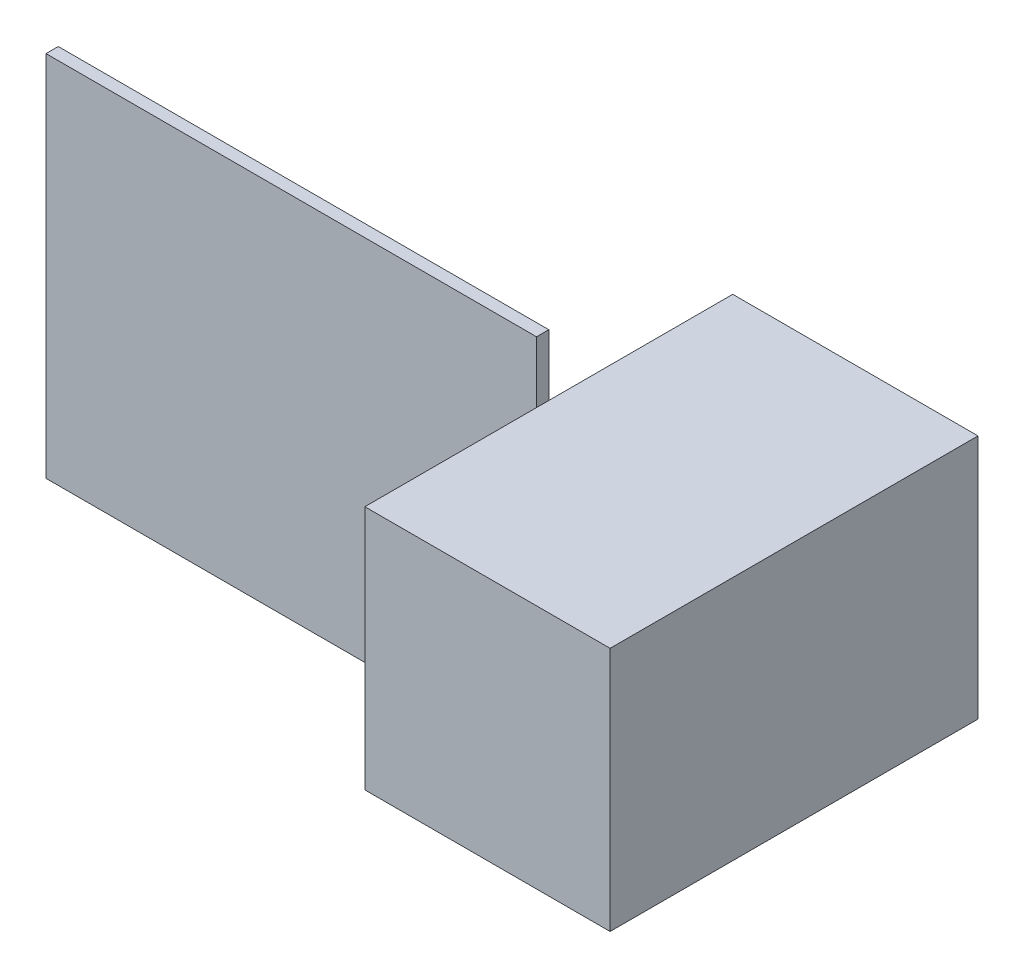
ISO-10303-21;
HEADER;
FILE_DESCRIPTION(('STEP AP214'),'2;1');
FILE_NAME('part.step','',(''),(''),'','','');
FILE_SCHEMA(('AUTOMOTIVE_DESIGN { 1 0 10303 214 1 1 1 1 }'));
ENDSEC;
DATA;
#1=APPLICATION_CONTEXT('core data for automotive mechanical design processes');
#2=APPLICATION_PROTOCOL_DEFINITION('international standard','automotive_design',2000,#1);
#3=PRODUCT_CONTEXT('',#1,'mechanical');
#4=PRODUCT('Part','Part','',(#3));
#5=PRODUCT_RELATED_PRODUCT_CATEGORY('part','',(#4));
#6=PRODUCT_DEFINITION_FORMATION('','',#4);
#7=PRODUCT_DEFINITION_CONTEXT('part definition',#1,'design');
#8=PRODUCT_DEFINITION('design','',#6,#7);
#9=PRODUCT_DEFINITION_SHAPE('','',#8);
#10=(LENGTH_UNIT() NAMED_UNIT(*) SI_UNIT(.MILLI.,.METRE.));
#11=(NAMED_UNIT(*) PLANE_ANGLE_UNIT() SI_UNIT($,.RADIAN.));
#12=(NAMED_UNIT(*) SI_UNIT($,.STERADIAN.) SOLID_ANGLE_UNIT());
#13=UNCERTAINTY_MEASURE_WITH_UNIT(LENGTH_MEASURE(1.E-05),#10,'distance_accuracy_value','');
#14=(GEOMETRIC_REPRESENTATION_CONTEXT(3) GLOBAL_UNCERTAINTY_ASSIGNED_CONTEXT((#13)) GLOBAL_UNIT_ASSIGNED_CONTEXT((#10,
#11,#12)) REPRESENTATION_CONTEXT('',''));
#15=CARTESIAN_POINT('',(0.,0.,0.));
#16=DIRECTION('',(0.,0.,1.));
#17=DIRECTION('',(1.,0.,0.));
#18=AXIS2_PLACEMENT_3D('',#15,#16,#17);
#19=CARTESIAN_POINT('',(40.,30.,2.));
#20=DIRECTION('',(-1.,0.,0.));
#21=DIRECTION('',(0.,0.,1.));
#22=AXIS2_PLACEMENT_3D('',#19,#20,#21);
#23=PLANE('',#22);
#24=DIRECTION('',(0.,0.,1.));
#25=VECTOR('',#24,1.);
#26=CARTESIAN_POINT('',(40.,20.,30.));
#27=LINE('',#26,#25);
#28=CARTESIAN_POINT('',(40.,20.,0.));
#29=VERTEX_POINT('',#28);
#30=CARTESIAN_POINT('',(40.,20.,2.));
#31=VERTEX_POINT('',#30);
#32=EDGE_CURVE('E11',#29,#31,#27,.T.);
#33=ORIENTED_EDGE('',*,*,#32,.F.);
#34=DIRECTION('',(0.,1.,0.));
#35=VECTOR('',#34,1.);
#36=CARTESIAN_POINT('',(40.,30.,0.));
#37=LINE('',#36,#35);
#38=CARTESIAN_POINT('',(40.,30.,0.));
#39=VERTEX_POINT('',#38);
#40=EDGE_CURVE('E161',#29,#39,#37,.T.);
#41=ORIENTED_EDGE('',*,*,#40,.T.);
#42=DIRECTION('',(0.,0.,-1.));
#43=VECTOR('',#42,1.);
#44=CARTESIAN_POINT('',(40.,30.,2.));
#45=LINE('',#44,#43);
#46=CARTESIAN_POINT('',(40.,30.,2.));
#47=VERTEX_POINT('',#46);
#48=EDGE_CURVE('E168',#47,#39,#45,.T.);
#49=ORIENTED_EDGE('',*,*,#48,.F.);
#50=DIRECTION('',(0.,1.,0.));
#51=VECTOR('',#50,1.);
#52=CARTESIAN_POINT('',(40.,30.,2.));
#53=LINE('',#52,#51);
#54=EDGE_CURVE('E52',#31,#47,#53,.T.);
#55=ORIENTED_EDGE('',*,*,#54,.F.);
#56=EDGE_LOOP('',(#33,#41,#49,#55));
#57=FACE_BOUND('',#56,.T.);
#58=ADVANCED_FACE('F33',(#57),#23,.F.);
#59=DIRECTION('',(0.,0.,-1.));
#60=VECTOR('',#59,1.);
#61=CARTESIAN_POINT('',(40.,-20.,30.));
#62=LINE('',#61,#60);
#63=CARTESIAN_POINT('',(40.,-20.,2.));
#64=VERTEX_POINT('',#63);
#65=CARTESIAN_POINT('',(40.,-20.,0.));
#66=VERTEX_POINT('',#65);
#67=EDGE_CURVE('E42',#64,#66,#62,.T.);
#68=ORIENTED_EDGE('',*,*,#67,.F.);
#69=CARTESIAN_POINT('',(40.,-30.,2.));
#70=VERTEX_POINT('',#69);
#71=EDGE_CURVE('E154',#70,#64,#53,.T.);
#72=ORIENTED_EDGE('',*,*,#71,.F.);
#73=DIRECTION('',(0.,0.,-1.));
#74=VECTOR('',#73,1.);
#75=CARTESIAN_POINT('',(40.,-30.,2.));
#76=LINE('',#75,#74);
#77=CARTESIAN_POINT('',(40.,-30.,0.));
#78=VERTEX_POINT('',#77);
#79=EDGE_CURVE('E170',#70,#78,#76,.T.);
#80=ORIENTED_EDGE('',*,*,#79,.T.);
#81=EDGE_CURVE('E162',#78,#66,#37,.T.);
#82=ORIENTED_EDGE('',*,*,#81,.T.);
#83=EDGE_LOOP('',(#68,#72,#80,#82));
#84=FACE_BOUND('',#83,.T.);
#85=ADVANCED_FACE('F227',(#84),#23,.F.);
#86=CARTESIAN_POINT('',(-40.,30.,2.));
#87=DIRECTION('',(1.,0.,0.));
#88=DIRECTION('',(0.,0.,-1.));
#89=AXIS2_PLACEMENT_3D('',#86,#87,#88);
#90=PLANE('',#89);
#91=DIRECTION('',(0.,-1.,0.));
#92=VECTOR('',#91,1.);
#93=CARTESIAN_POINT('',(-40.,30.,0.));
#94=LINE('',#93,#92);
#95=CARTESIAN_POINT('',(-40.,30.,0.));
#96=VERTEX_POINT('',#95);
#97=CARTESIAN_POINT('',(-40.,-30.,0.));
#98=VERTEX_POINT('',#97);
#99=EDGE_CURVE('E139',#96,#98,#94,.T.);
#100=ORIENTED_EDGE('',*,*,#99,.T.);
#101=DIRECTION('',(0.,0.,-1.));
#102=VECTOR('',#101,1.);
#103=CARTESIAN_POINT('',(-40.,-30.,2.));
#104=LINE('',#103,#102);
#105=CARTESIAN_POINT('',(-40.,-30.,2.));
#106=VERTEX_POINT('',#105);
#107=EDGE_CURVE('E37',#106,#98,#104,.T.);
#108=ORIENTED_EDGE('',*,*,#107,.F.);
#109=DIRECTION('',(0.,-1.,0.));
#110=VECTOR('',#109,1.);
#111=CARTESIAN_POINT('',(-40.,30.,2.));
#112=LINE('',#111,#110);
#113=CARTESIAN_POINT('',(-40.,30.,2.));
#114=VERTEX_POINT('',#113);
#115=EDGE_CURVE('E148',#114,#106,#112,.T.);
#116=ORIENTED_EDGE('',*,*,#115,.F.);
#117=DIRECTION('',(0.,0.,-1.));
#118=VECTOR('',#117,1.);
#119=CARTESIAN_POINT('',(-40.,30.,2.));
#120=LINE('',#119,#118);
#121=EDGE_CURVE('E158',#114,#96,#120,.T.);
#122=ORIENTED_EDGE('',*,*,#121,.T.);
#123=EDGE_LOOP('',(#100,#108,#116,#122));
#124=FACE_BOUND('',#123,.T.);
#125=ADVANCED_FACE('F35',(#124),#90,.F.);
#126=CARTESIAN_POINT('',(-40.,-30.,2.));
#127=DIRECTION('',(0.,1.,0.));
#128=DIRECTION('',(0.,0.,1.));
#129=AXIS2_PLACEMENT_3D('',#126,#127,#128);
#130=PLANE('',#129);
#131=DIRECTION('',(1.,0.,0.));
#132=VECTOR('',#131,1.);
#133=CARTESIAN_POINT('',(-40.,-30.,0.));
#134=LINE('',#133,#132);
#135=EDGE_CURVE('E142',#98,#78,#134,.T.);
#136=ORIENTED_EDGE('',*,*,#135,.T.);
#137=ORIENTED_EDGE('',*,*,#79,.F.);
#138=DIRECTION('',(1.,0.,0.));
#139=VECTOR('',#138,1.);
#140=CARTESIAN_POINT('',(-40.,-30.,2.));
#141=LINE('',#140,#139);
#142=EDGE_CURVE('E151',#106,#70,#141,.T.);
#143=ORIENTED_EDGE('',*,*,#142,.F.);
#144=ORIENTED_EDGE('',*,*,#107,.T.);
#145=EDGE_LOOP('',(#136,#137,#143,#144));
#146=FACE_BOUND('',#145,.T.);
#147=ADVANCED_FACE('F234',(#146),#130,.F.);
#148=CARTESIAN_POINT('',(-40.,30.,2.));
#149=DIRECTION('',(0.,-1.,0.));
#150=DIRECTION('',(0.,0.,-1.));
#151=AXIS2_PLACEMENT_3D('',#148,#149,#150);
#152=PLANE('',#151);
#153=DIRECTION('',(-1.,0.,0.));
#154=VECTOR('',#153,1.);
#155=CARTESIAN_POINT('',(-40.,30.,0.));
#156=LINE('',#155,#154);
#157=EDGE_CURVE('E152',#39,#96,#156,.T.);
#158=ORIENTED_EDGE('',*,*,#157,.T.);
#159=ORIENTED_EDGE('',*,*,#121,.F.);
#160=DIRECTION('',(-1.,0.,0.));
#161=VECTOR('',#160,1.);
#162=CARTESIAN_POINT('',(-40.,30.,2.));
#163=LINE('',#162,#161);
#164=EDGE_CURVE('E156',#47,#114,#163,.T.);
#165=ORIENTED_EDGE('',*,*,#164,.F.);
#166=ORIENTED_EDGE('',*,*,#48,.T.);
#167=EDGE_LOOP('',(#158,#159,#165,#166));
#168=FACE_BOUND('',#167,.T.);
#169=ADVANCED_FACE('F207',(#168),#152,.F.);
#170=CARTESIAN_POINT('',(0.,0.,2.));
#171=DIRECTION('',(0.,0.,1.));
#172=DIRECTION('',(1.,0.,0.));
#173=AXIS2_PLACEMENT_3D('',#170,#171,#172);
#174=PLANE('',#173);
#175=ORIENTED_EDGE('',*,*,#115,.T.);
#176=ORIENTED_EDGE('',*,*,#142,.T.);
#177=ORIENTED_EDGE('',*,*,#71,.T.);
#178=EDGE_CURVE('E157',#64,#31,#53,.T.);
#179=ORIENTED_EDGE('',*,*,#178,.T.);
#180=ORIENTED_EDGE('',*,*,#54,.T.);
#181=ORIENTED_EDGE('',*,*,#164,.T.);
#182=EDGE_LOOP('',(#175,#176,#177,#179,#180,#181));
#183=FACE_BOUND('',#182,.T.);
#184=ADVANCED_FACE('F214',(#183),#174,.T.);
#185=CARTESIAN_POINT('',(0.,0.,0.));
#186=DIRECTION('',(0.,0.,1.));
#187=DIRECTION('',(1.,0.,0.));
#188=AXIS2_PLACEMENT_3D('',#185,#186,#187);
#189=PLANE('',#188);
#190=ORIENTED_EDGE('',*,*,#99,.F.);
#191=ORIENTED_EDGE('',*,*,#157,.F.);
#192=ORIENTED_EDGE('',*,*,#40,.F.);
#193=EDGE_CURVE('E164',#66,#29,#37,.T.);
#194=ORIENTED_EDGE('',*,*,#193,.F.);
#195=ORIENTED_EDGE('',*,*,#81,.F.);
#196=ORIENTED_EDGE('',*,*,#135,.F.);
#197=EDGE_LOOP('',(#190,#191,#192,#194,#195,#196));
#198=FACE_BOUND('',#197,.T.);
#199=ADVANCED_FACE('F210',(#198),#189,.F.);
#200=CARTESIAN_POINT('',(40.,0.,0.));
#201=DIRECTION('',(1.,0.,0.));
#202=DIRECTION('',(0.,0.,-1.));
#203=AXIS2_PLACEMENT_3D('',#200,#201,#202);
#204=PLANE('',#203);
#205=CARTESIAN_POINT('',(40.,-20.,-30.));
#206=VERTEX_POINT('',#205);
#207=EDGE_CURVE('E179',#66,#206,#62,.T.);
#208=ORIENTED_EDGE('',*,*,#207,.F.);
#209=ORIENTED_EDGE('',*,*,#193,.T.);
#210=CARTESIAN_POINT('',(40.,20.,-30.));
#211=VERTEX_POINT('',#210);
#212=EDGE_CURVE('E44',#211,#29,#27,.T.);
#213=ORIENTED_EDGE('',*,*,#212,.F.);
#214=DIRECTION('',(0.,1.,0.));
#215=VECTOR('',#214,1.);
#216=CARTESIAN_POINT('',(40.,20.,-30.));
#217=LINE('',#216,#215);
#218=EDGE_CURVE('E182',#206,#211,#217,.T.);
#219=ORIENTED_EDGE('',*,*,#218,.F.);
#220=EDGE_LOOP('',(#208,#209,#213,#219));
#221=FACE_BOUND('',#220,.T.);
#222=ADVANCED_FACE('F200',(#221),#204,.F.);
#223=CARTESIAN_POINT('',(80.,20.,30.));
#224=DIRECTION('',(0.,0.,-1.));
#225=DIRECTION('',(-1.,0.,0.));
#226=AXIS2_PLACEMENT_3D('',#223,#224,#225);
#227=PLANE('',#226);
#228=DIRECTION('',(0.,-1.,0.));
#229=VECTOR('',#228,1.);
#230=CARTESIAN_POINT('',(40.,20.,30.));
#231=LINE('',#230,#229);
#232=CARTESIAN_POINT('',(40.,20.,30.));
#233=VERTEX_POINT('',#232);
#234=CARTESIAN_POINT('',(40.,-20.,30.));
#235=VERTEX_POINT('',#234);
#236=EDGE_CURVE('E138',#233,#235,#231,.T.);
#237=ORIENTED_EDGE('',*,*,#236,.T.);
#238=DIRECTION('',(-1.,0.,0.));
#239=VECTOR('',#238,1.);
#240=CARTESIAN_POINT('',(80.,-20.,30.));
#241=LINE('',#240,#239);
#242=CARTESIAN_POINT('',(80.,-20.,30.));
#243=VERTEX_POINT('',#242);
#244=EDGE_CURVE('E119',#243,#235,#241,.T.);
#245=ORIENTED_EDGE('',*,*,#244,.F.);
#246=DIRECTION('',(0.,-1.,0.));
#247=VECTOR('',#246,1.);
#248=CARTESIAN_POINT('',(80.,20.,30.));
#249=LINE('',#248,#247);
#250=CARTESIAN_POINT('',(80.,20.,30.));
#251=VERTEX_POINT('',#250);
#252=EDGE_CURVE('E126',#251,#243,#249,.T.);
#253=ORIENTED_EDGE('',*,*,#252,.F.);
#254=DIRECTION('',(-1.,0.,0.));
#255=VECTOR('',#254,1.);
#256=CARTESIAN_POINT('',(80.,20.,30.));
#257=LINE('',#256,#255);
#258=EDGE_CURVE('E186',#251,#233,#257,.T.);
#259=ORIENTED_EDGE('',*,*,#258,.T.);
#260=EDGE_LOOP('',(#237,#245,#253,#259));
#261=FACE_BOUND('',#260,.T.);
#262=ADVANCED_FACE('F136',(#261),#227,.F.);
#263=CARTESIAN_POINT('',(80.,-20.,30.));
#264=DIRECTION('',(0.,1.,0.));
#265=DIRECTION('',(0.,0.,1.));
#266=AXIS2_PLACEMENT_3D('',#263,#264,#265);
#267=PLANE('',#266);
#268=EDGE_CURVE('E178',#235,#64,#62,.T.);
#269=ORIENTED_EDGE('',*,*,#268,.T.);
#270=ORIENTED_EDGE('',*,*,#67,.T.);
#271=ORIENTED_EDGE('',*,*,#207,.T.);
#272=DIRECTION('',(-1.,0.,0.));
#273=VECTOR('',#272,1.);
#274=CARTESIAN_POINT('',(80.,-20.,-30.));
#275=LINE('',#274,#273);
#276=CARTESIAN_POINT('',(80.,-20.,-30.));
#277=VERTEX_POINT('',#276);
#278=EDGE_CURVE('E122',#277,#206,#275,.T.);
#279=ORIENTED_EDGE('',*,*,#278,.F.);
#280=DIRECTION('',(0.,0.,-1.));
#281=VECTOR('',#280,1.);
#282=CARTESIAN_POINT('',(80.,-20.,30.));
#283=LINE('',#282,#281);
#284=EDGE_CURVE('E114',#243,#277,#283,.T.);
#285=ORIENTED_EDGE('',*,*,#284,.F.);
#286=ORIENTED_EDGE('',*,*,#244,.T.);
#287=EDGE_LOOP('',(#269,#270,#271,#279,#285,#286));
#288=FACE_BOUND('',#287,.T.);
#289=ADVANCED_FACE('F117',(#288),#267,.F.);
#290=CARTESIAN_POINT('',(80.,20.,-30.));
#291=DIRECTION('',(0.,0.,1.));
#292=DIRECTION('',(1.,0.,0.));
#293=AXIS2_PLACEMENT_3D('',#290,#291,#292);
#294=PLANE('',#293);
#295=ORIENTED_EDGE('',*,*,#218,.T.);
#296=DIRECTION('',(-1.,0.,0.));
#297=VECTOR('',#296,1.);
#298=CARTESIAN_POINT('',(80.,20.,-30.));
#299=LINE('',#298,#297);
#300=CARTESIAN_POINT('',(80.,20.,-30.));
#301=VERTEX_POINT('',#300);
#302=EDGE_CURVE('E144',#301,#211,#299,.T.);
#303=ORIENTED_EDGE('',*,*,#302,.F.);
#304=DIRECTION('',(0.,1.,0.));
#305=VECTOR('',#304,1.);
#306=CARTESIAN_POINT('',(80.,20.,-30.));
#307=LINE('',#306,#305);
#308=EDGE_CURVE('E125',#277,#301,#307,.T.);
#309=ORIENTED_EDGE('',*,*,#308,.F.);
#310=ORIENTED_EDGE('',*,*,#278,.T.);
#311=EDGE_LOOP('',(#295,#303,#309,#310));
#312=FACE_BOUND('',#311,.T.);
#313=ADVANCED_FACE('F190',(#312),#294,.F.);
#314=CARTESIAN_POINT('',(80.,20.,30.));
#315=DIRECTION('',(0.,-1.,0.));
#316=DIRECTION('',(0.,0.,-1.));
#317=AXIS2_PLACEMENT_3D('',#314,#315,#316);
#318=PLANE('',#317);
#319=ORIENTED_EDGE('',*,*,#212,.T.);
#320=ORIENTED_EDGE('',*,*,#32,.T.);
#321=EDGE_CURVE('E45',#31,#233,#27,.T.);
#322=ORIENTED_EDGE('',*,*,#321,.T.);
#323=ORIENTED_EDGE('',*,*,#258,.F.);
#324=DIRECTION('',(0.,0.,1.));
#325=VECTOR('',#324,1.);
#326=CARTESIAN_POINT('',(80.,20.,30.));
#327=LINE('',#326,#325);
#328=EDGE_CURVE('E131',#301,#251,#327,.T.);
#329=ORIENTED_EDGE('',*,*,#328,.F.);
#330=ORIENTED_EDGE('',*,*,#302,.T.);
#331=EDGE_LOOP('',(#319,#320,#322,#323,#329,#330));
#332=FACE_BOUND('',#331,.T.);
#333=ADVANCED_FACE('F195',(#332),#318,.F.);
#334=CARTESIAN_POINT('',(80.,0.,0.));
#335=DIRECTION('',(1.,0.,0.));
#336=DIRECTION('',(0.,0.,-1.));
#337=AXIS2_PLACEMENT_3D('',#334,#335,#336);
#338=PLANE('',#337);
#339=ORIENTED_EDGE('',*,*,#252,.T.);
#340=ORIENTED_EDGE('',*,*,#284,.T.);
#341=ORIENTED_EDGE('',*,*,#308,.T.);
#342=ORIENTED_EDGE('',*,*,#328,.T.);
#343=EDGE_LOOP('',(#339,#340,#341,#342));
#344=FACE_BOUND('',#343,.T.);
#345=ADVANCED_FACE('F129',(#344),#338,.T.);
#346=ORIENTED_EDGE('',*,*,#178,.F.);
#347=ORIENTED_EDGE('',*,*,#268,.F.);
#348=ORIENTED_EDGE('',*,*,#236,.F.);
#349=ORIENTED_EDGE('',*,*,#321,.F.);
#350=EDGE_LOOP('',(#346,#347,#348,#349));
#351=FACE_BOUND('',#350,.T.);
#352=ADVANCED_FACE('F217',(#351),#204,.F.);
#353=CLOSED_SHELL('',(#58,#85,#125,#147,#169,#184,#199,#222,#262,#289,#313,#333,#345,#352));
#354=MANIFOLD_SOLID_BREP('B2',#353);
#355=ADVANCED_BREP_SHAPE_REPRESENTATION('',(#18,#354),#14);
#356=SHAPE_DEFINITION_REPRESENTATION(#9,#355);
ENDSEC;
END-ISO-10303-21;
